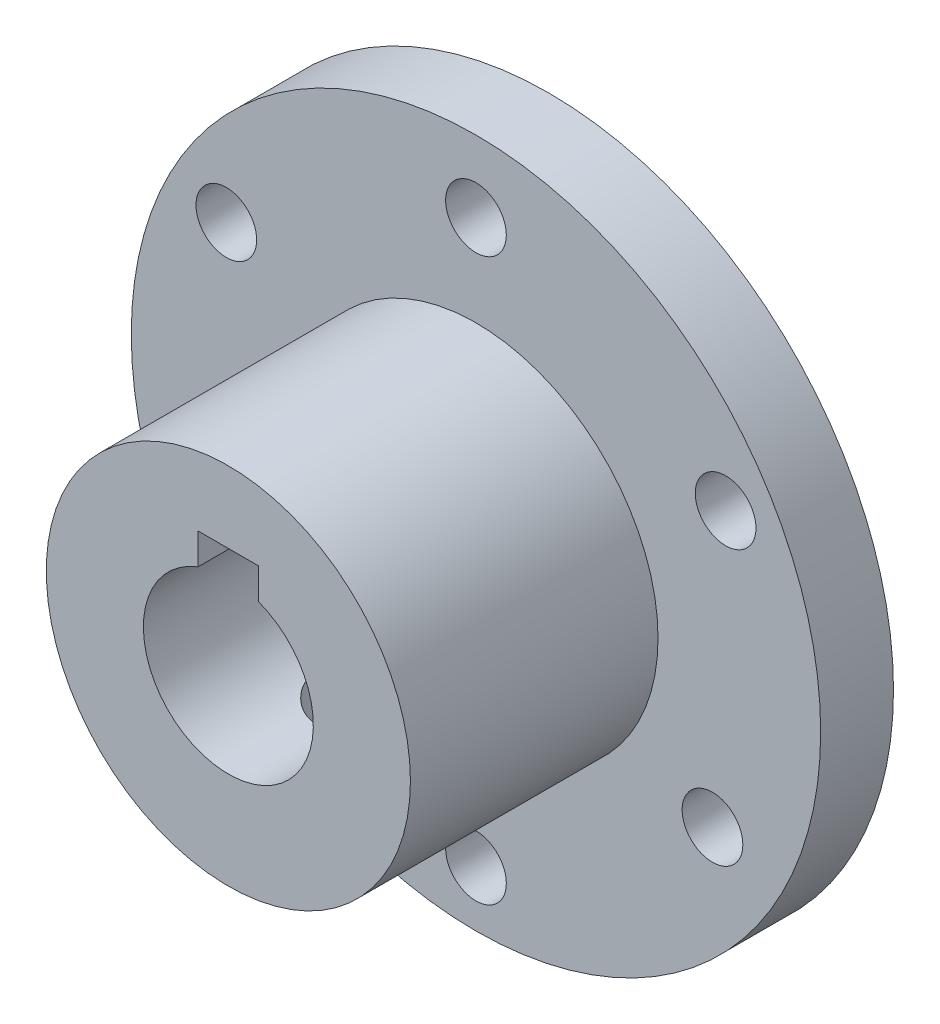
ISO-10303-21;
HEADER;
FILE_DESCRIPTION(('STEP AP214'),'2;1');
FILE_NAME('part.step','',(''),(''),'','','');
FILE_SCHEMA(('AUTOMOTIVE_DESIGN { 1 0 10303 214 1 1 1 1 }'));
ENDSEC;
DATA;
#1=APPLICATION_CONTEXT('core data for automotive mechanical design processes');
#2=APPLICATION_PROTOCOL_DEFINITION('international standard','automotive_design',2000,#1);
#3=PRODUCT_CONTEXT('',#1,'mechanical');
#4=PRODUCT('Part','Part','',(#3));
#5=PRODUCT_RELATED_PRODUCT_CATEGORY('part','',(#4));
#6=PRODUCT_DEFINITION_FORMATION('','',#4);
#7=PRODUCT_DEFINITION_CONTEXT('part definition',#1,'design');
#8=PRODUCT_DEFINITION('design','',#6,#7);
#9=PRODUCT_DEFINITION_SHAPE('','',#8);
#10=(LENGTH_UNIT() NAMED_UNIT(*) SI_UNIT(.MILLI.,.METRE.));
#11=(NAMED_UNIT(*) PLANE_ANGLE_UNIT() SI_UNIT($,.RADIAN.));
#12=(NAMED_UNIT(*) SI_UNIT($,.STERADIAN.) SOLID_ANGLE_UNIT());
#13=UNCERTAINTY_MEASURE_WITH_UNIT(LENGTH_MEASURE(1.E-05),#10,'distance_accuracy_value','');
#14=(GEOMETRIC_REPRESENTATION_CONTEXT(3) GLOBAL_UNCERTAINTY_ASSIGNED_CONTEXT((#13)) GLOBAL_UNIT_ASSIGNED_CONTEXT((#10,
#11,#12)) REPRESENTATION_CONTEXT('',''));
#15=CARTESIAN_POINT('',(0.,0.,0.));
#16=DIRECTION('',(0.,0.,1.));
#17=DIRECTION('',(1.,0.,0.));
#18=AXIS2_PLACEMENT_3D('',#15,#16,#17);
#19=CARTESIAN_POINT('',(0.,0.,20.4));
#20=DIRECTION('',(0.,0.,1.));
#21=DIRECTION('',(1.,0.,0.));
#22=AXIS2_PLACEMENT_3D('',#19,#20,#21);
#23=PLANE('',#22);
#24=DIRECTION('',(0.,-1.,0.));
#25=VECTOR('',#24,1.);
#26=CARTESIAN_POINT('',(-2.5,4.9,20.4));
#27=LINE('',#26,#25);
#28=CARTESIAN_POINT('',(-2.5,9.1,20.4));
#29=VERTEX_POINT('',#28);
#30=CARTESIAN_POINT('',(-2.5,6.53834841531101,20.4));
#31=VERTEX_POINT('',#30);
#32=EDGE_CURVE('E105',#29,#31,#27,.T.);
#33=ORIENTED_EDGE('',*,*,#32,.F.);
#34=DIRECTION('',(-1.,0.,0.));
#35=VECTOR('',#34,1.);
#36=CARTESIAN_POINT('',(2.5,9.1,20.4));
#37=LINE('',#36,#35);
#38=CARTESIAN_POINT('',(2.5,9.1,20.4));
#39=VERTEX_POINT('',#38);
#40=EDGE_CURVE('E89',#39,#29,#37,.T.);
#41=ORIENTED_EDGE('',*,*,#40,.F.);
#42=DIRECTION('',(0.,1.,0.));
#43=VECTOR('',#42,1.);
#44=CARTESIAN_POINT('',(2.5,4.9,20.4));
#45=LINE('',#44,#43);
#46=CARTESIAN_POINT('',(2.5,6.53834841531101,20.4));
#47=VERTEX_POINT('',#46);
#48=EDGE_CURVE('E97',#47,#39,#45,.T.);
#49=ORIENTED_EDGE('',*,*,#48,.F.);
#50=CARTESIAN_POINT('',(0.,0.,20.4));
#51=DIRECTION('',(0.,0.,1.));
#52=DIRECTION('',(1.,0.,0.));
#53=AXIS2_PLACEMENT_3D('',#50,#51,#52);
#54=CIRCLE('',#53,7.);
#55=EDGE_CURVE('E179',#31,#47,#54,.T.);
#56=ORIENTED_EDGE('',*,*,#55,.F.);
#57=EDGE_LOOP('',(#33,#41,#49,#56));
#58=FACE_BOUND('',#57,.T.);
#59=CARTESIAN_POINT('',(0.,0.,20.4));
#60=DIRECTION('',(0.,0.,1.));
#61=DIRECTION('',(1.,0.,0.));
#62=AXIS2_PLACEMENT_3D('',#59,#60,#61);
#63=CIRCLE('',#62,15.);
#64=CARTESIAN_POINT('',(15.,0.,20.4));
#65=VERTEX_POINT('',#64);
#66=EDGE_CURVE('E182',#65,#65,#63,.T.);
#67=ORIENTED_EDGE('',*,*,#66,.T.);
#68=EDGE_LOOP('',(#67));
#69=FACE_BOUND('',#68,.T.);
#70=ADVANCED_FACE('F39',(#58,#69),#23,.T.);
#71=CARTESIAN_POINT('',(0.,0.,20.4));
#72=DIRECTION('',(0.,0.,-1.));
#73=DIRECTION('',(-1.,0.,0.));
#74=AXIS2_PLACEMENT_3D('',#71,#72,#73);
#75=CYLINDRICAL_SURFACE('',#74,15.);
#76=CARTESIAN_POINT('',(0.,-15.,13.2));
#77=CARTESIAN_POINT('',(0.1667307203779,-14.9999969274261,13.199993866505));
#78=CARTESIAN_POINT('',(0.333538980604567,-14.9971915553469,13.1860534710971));
#79=CARTESIAN_POINT('',(0.662440523067058,-14.9862709686969,13.1307044996543));
#80=CARTESIAN_POINT('',(0.824529952624067,-14.9781515358056,13.0892741015955));
#81=CARTESIAN_POINT('',(1.13919091578994,-14.9575094783486,12.9802761791376));
#82=CARTESIAN_POINT('',(1.2917714037994,-14.9449910723015,12.9127336894659));
#83=CARTESIAN_POINT('',(1.58342396659268,-14.9169119410594,12.7535032574661));
#84=CARTESIAN_POINT('',(1.72249684522744,-14.9013513970712,12.6618167531784));
#85=CARTESIAN_POINT('',(1.9850804319446,-14.8686649598991,12.4555845171257));
#86=CARTESIAN_POINT('',(2.10838185347557,-14.8515223651304,12.3407749338264));
#87=CARTESIAN_POINT('',(2.33411026982409,-14.8177254135776,12.0921227508249));
#88=CARTESIAN_POINT('',(2.43653563431127,-14.8010710950127,11.9582786659946));
#89=CARTESIAN_POINT('',(2.61849526004286,-14.7699732543785,11.6738514209644));
#90=CARTESIAN_POINT('',(2.6978128165976,-14.7555512209484,11.5231270686109));
#91=CARTESIAN_POINT('',(2.82991699974092,-14.7307880417525,11.2101545429878));
#92=CARTESIAN_POINT('',(2.88270624731171,-14.7204464928588,11.047907509961));
#93=CARTESIAN_POINT('',(2.95957589965448,-14.7051841575661,10.7187469082762));
#94=CARTESIAN_POINT('',(2.98402349387633,-14.7001941032156,10.5519223675733));
#95=CARTESIAN_POINT('',(3.00465638317836,-14.6959912518188,10.216470535907));
#96=CARTESIAN_POINT('',(3.0008445681405,-14.6967778640352,10.0478434310396));
#97=CARTESIAN_POINT('',(2.96536371930546,-14.7039765344455,9.71625963593699));
#98=CARTESIAN_POINT('',(2.93411562073172,-14.7103035857629,9.55325578311806));
#99=CARTESIAN_POINT('',(2.84531365386915,-14.7277363848,9.23485177001099));
#100=CARTESIAN_POINT('',(2.78775852930204,-14.7388423607334,9.07945197324297));
#101=CARTESIAN_POINT('',(2.64757435102416,-14.7646685550122,8.7794542148892));
#102=CARTESIAN_POINT('',(2.56477845369634,-14.7794126944111,8.63493636129248));
#103=CARTESIAN_POINT('',(2.37658072371804,-14.8108385631919,8.36168745008156));
#104=CARTESIAN_POINT('',(2.27117629307049,-14.827520515151,8.23295820944653));
#105=CARTESIAN_POINT('',(2.03849980368175,-14.8613106372439,7.99251179262919));
#106=CARTESIAN_POINT('',(1.91086848363733,-14.8784210763271,7.88114229642261));
#107=CARTESIAN_POINT('',(1.63855507218603,-14.9108654614323,7.68133846109633));
#108=CARTESIAN_POINT('',(1.49387276213817,-14.9261993846692,7.59290441611926));
#109=CARTESIAN_POINT('',(1.19117816063676,-14.9534007048266,7.44141747232207));
#110=CARTESIAN_POINT('',(1.0331454587559,-14.9652626654482,7.37840431906639));
#111=CARTESIAN_POINT('',(0.708446929345995,-14.9841422696357,7.2799185778843));
#112=CARTESIAN_POINT('',(0.541782150217349,-14.9911605000159,7.24444265377911));
#113=CARTESIAN_POINT('',(0.207538216881452,-14.999480156006,7.20253063861717));
#114=CARTESIAN_POINT('',(0.0400209849767288,-15.0008752395741,7.19561874137919));
#115=CARTESIAN_POINT('',(-0.293774802578142,-14.9980515579031,7.20974957682654));
#116=CARTESIAN_POINT('',(-0.460053427331379,-14.9938331082434,7.23079073805779));
#117=CARTESIAN_POINT('',(-0.785116979839622,-14.9803149602405,7.29983512063187));
#118=CARTESIAN_POINT('',(-0.943955845019709,-14.9710612921262,7.34759420549371));
#119=CARTESIAN_POINT('',(-1.251370882499,-14.948506561831,7.46845194796743));
#120=CARTESIAN_POINT('',(-1.39994628491262,-14.9352051964268,7.54155250403049));
#121=CARTESIAN_POINT('',(-1.68462352105865,-14.9057973459988,7.71204747195394));
#122=CARTESIAN_POINT('',(-1.82055038025656,-14.8896585131116,7.80972834311684));
#123=CARTESIAN_POINT('',(-2.07425405735762,-14.8564420448965,8.02622757362184));
#124=CARTESIAN_POINT('',(-2.19202892679229,-14.8393643090516,8.1450481991996));
#125=CARTESIAN_POINT('',(-2.40792177232253,-14.8058791067089,8.40262005567337));
#126=CARTESIAN_POINT('',(-2.50571310734597,-14.7894858069991,8.54164723266401));
#127=CARTESIAN_POINT('',(-2.67655626015362,-14.7595257538858,8.83443408407004));
#128=CARTESIAN_POINT('',(-2.74960906776871,-14.7459588874003,8.98819316872066));
#129=CARTESIAN_POINT('',(-2.86845552474588,-14.7233022175315,9.30530473844864));
#130=CARTESIAN_POINT('',(-2.91439049937315,-14.7141892461656,9.46860252363096));
#131=CARTESIAN_POINT('',(-2.97812595488159,-14.7014231037608,9.80080036047271));
#132=CARTESIAN_POINT('',(-2.99593010467534,-14.6977692207333,9.96969967862804));
#133=CARTESIAN_POINT('',(-3.00276273260241,-14.6963744889414,10.305026593633));
#134=CARTESIAN_POINT('',(-2.99230736421269,-14.698527575679,10.471443446781));
#135=CARTESIAN_POINT('',(-2.94405691230018,-14.7082672045384,10.8000949497151));
#136=CARTESIAN_POINT('',(-2.90626204838789,-14.7158537030151,10.9623296330844));
#137=CARTESIAN_POINT('',(-2.80463570549686,-14.7355579265748,11.2776831337216));
#138=CARTESIAN_POINT('',(-2.74086752015203,-14.7476646305649,11.4308230815072));
#139=CARTESIAN_POINT('',(-2.58916393380481,-14.7750514492251,11.7243111622033));
#140=CARTESIAN_POINT('',(-2.50122650632465,-14.7903318299668,11.8646582211754));
#141=CARTESIAN_POINT('',(-2.30191774435924,-14.8226688156968,12.1311467164509));
#142=CARTESIAN_POINT('',(-2.19017366170554,-14.839751187291,12.2570062958028));
#143=CARTESIAN_POINT('',(-1.94719310703942,-14.8735824561586,12.4883586165875));
#144=CARTESIAN_POINT('',(-1.81595216146,-14.8903312758955,12.5938466709518));
#145=CARTESIAN_POINT('',(-1.53605288726474,-14.9218149716391,12.7825039318393));
#146=CARTESIAN_POINT('',(-1.3872266532895,-14.9365269365774,12.8654280098401));
#147=CARTESIAN_POINT('',(-1.0774990828222,-14.96205375255,13.0049583677898));
#148=CARTESIAN_POINT('',(-0.916608782589379,-14.9728721141585,13.0615883685975));
#149=CARTESIAN_POINT('',(-0.629464466771338,-14.9872911778611,13.1359558441341));
#150=CARTESIAN_POINT('',(-0.504844992041353,-14.9920290947535,13.1599295811233));
#151=CARTESIAN_POINT('',(-0.2534985756302,-14.9983846241968,13.1919537370751));
#152=CARTESIAN_POINT('',(-0.126771701245857,-15.0000023361946,13.2000046635293));
#153=CARTESIAN_POINT('',(0.,-15.,13.2));
#154=B_SPLINE_CURVE_WITH_KNOTS('',3,(#76,#77,#78,#79,#80,#81,#82,#83,#84,#85,#86,#87,#88,#89,
#90,#91,#92,#93,#94,#95,#96,#97,#98,#99,#100,#101,#102,#103,#104,#105,#106,#107,#108,#109,#110,
#111,#112,#113,#114,#115,#116,#117,#118,#119,#120,#121,#122,#123,#124,#125,#126,#127,#128,#129,
#130,#131,#132,#133,#134,#135,#136,#137,#138,#139,#140,#141,#142,#143,#144,#145,#146,#147,#148,
#149,#150,#151,#152,#153),.UNSPECIFIED.,.T.,.F.,(4,2,2,2,2,2,2,2,2,2,2,2,2,2,2,2,2,2,2,2,2,2,2,
2,2,2,2,2,2,2,2,2,2,2,2,2,2,2,4),(0.,0.499728391983775,0.99985395207397,1.49950120575103,
1.99911870669259,2.50479801033656,3.0105167902421,3.52083585017768,4.03110448095592,
4.53468555310762,5.03821512843675,5.53415181018835,6.03011217761189,6.52942470610778,
7.02879464249011,7.53714757474052,8.04550702619461,8.55465824562072,9.06374777094108,
9.56432207028796,10.064868229736,10.5609136185217,11.0569961764807,11.5591519810008,
12.0613616503779,12.5712188573768,13.081055661704,13.5882114309817,14.0953010499124,
14.593191677031,15.0910783047783,15.5877588375933,16.084481027456,16.5896422871743,
17.0949196359879,17.6054849002691,18.1155886655256,18.4955632586968,18.8755257411299),.UNSPECIFIED.);
#155=CARTESIAN_POINT('',(0.,-15.,13.2));
#156=VERTEX_POINT('',#155);
#157=EDGE_CURVE('E201',#156,#156,#154,.T.);
#158=ORIENTED_EDGE('',*,*,#157,.T.);
#159=EDGE_LOOP('',(#158));
#160=FACE_BOUND('',#159,.T.);
#161=ORIENTED_EDGE('',*,*,#66,.F.);
#162=EDGE_LOOP('',(#161));
#163=FACE_BOUND('',#162,.T.);
#164=CARTESIAN_POINT('',(0.,0.,0.));
#165=DIRECTION('',(0.,0.,1.));
#166=DIRECTION('',(1.,0.,0.));
#167=AXIS2_PLACEMENT_3D('',#164,#165,#166);
#168=CIRCLE('',#167,15.);
#169=CARTESIAN_POINT('',(15.,0.,0.));
#170=VERTEX_POINT('',#169);
#171=EDGE_CURVE('E175',#170,#170,#168,.T.);
#172=ORIENTED_EDGE('',*,*,#171,.T.);
#173=EDGE_LOOP('',(#172));
#174=FACE_BOUND('',#173,.T.);
#175=ADVANCED_FACE('F41',(#160,#163,#174),#75,.T.);
#176=CARTESIAN_POINT('',(0.,0.,20.4));
#177=DIRECTION('',(0.,0.,-1.));
#178=DIRECTION('',(-1.,0.,0.));
#179=AXIS2_PLACEMENT_3D('',#176,#177,#178);
#180=CYLINDRICAL_SURFACE('',#179,7.);
#181=CARTESIAN_POINT('',(0.,-7.,13.2));
#182=CARTESIAN_POINT('',(0.160281740269091,-6.9999940839629,13.1999925304185));
#183=CARTESIAN_POINT('',(0.320833907522429,-6.99443250051265,13.1870786839035));
#184=CARTESIAN_POINT('',(0.637349314958984,-6.97273920628719,13.1359176345735));
#185=CARTESIAN_POINT('',(0.793299928144206,-6.95658080950724,13.0976064709267));
#186=CARTESIAN_POINT('',(1.0955347051483,-6.91541630739346,12.9973302363749));
#187=CARTESIAN_POINT('',(1.24185033642246,-6.89044089228941,12.9354471561946));
#188=CARTESIAN_POINT('',(1.5218733278968,-6.83405660276648,12.7901355814363));
#189=CARTESIAN_POINT('',(1.6555840905338,-6.80264947176647,12.7067129239082));
#190=CARTESIAN_POINT('',(1.91384144205639,-6.7346782187555,12.5160723523121));
#191=CARTESIAN_POINT('',(2.03764045493602,-6.69793895962371,12.4079047401042));
#192=CARTESIAN_POINT('',(2.26599040232609,-6.62417654338771,12.1728561314992));
#193=CARTESIAN_POINT('',(2.3705306503261,-6.5871532404671,12.0459648153973));
#194=CARTESIAN_POINT('',(2.56285686126492,-6.51482055271223,11.7689672772845));
#195=CARTESIAN_POINT('',(2.64946811752636,-6.47970460244924,11.6179895419707));
#196=CARTESIAN_POINT('',(2.79573199408101,-6.41796168635026,11.301890571811));
#197=CARTESIAN_POINT('',(2.8553992914263,-6.39133010120133,11.1367770955138));
#198=CARTESIAN_POINT('',(2.94294919918374,-6.35147799087276,10.8056992616908));
#199=CARTESIAN_POINT('',(2.97227494401776,-6.3376522143554,10.6401922982205));
#200=CARTESIAN_POINT('',(3.00280607158394,-6.32324849688131,10.3060740303897));
#201=CARTESIAN_POINT('',(3.00402828615096,-6.32266262625149,10.1374646447086));
#202=CARTESIAN_POINT('',(2.97939999510613,-6.33429573902539,9.81670009628145));
#203=CARTESIAN_POINT('',(2.95576113815072,-6.34546870930158,9.664329376668));
#204=CARTESIAN_POINT('',(2.88580772808799,-6.37758411517576,9.36597241409867));
#205=CARTESIAN_POINT('',(2.83948852833539,-6.39852855266591,9.21998748611386));
#206=CARTESIAN_POINT('',(2.7245765907069,-6.44830685655465,8.93475284856477));
#207=CARTESIAN_POINT('',(2.65551974428426,-6.47730295111391,8.79571970578185));
#208=CARTESIAN_POINT('',(2.49742304873013,-6.53988493882129,8.53065367593057));
#209=CARTESIAN_POINT('',(2.40837507480489,-6.57347269593628,8.4046261050705));
#210=CARTESIAN_POINT('',(2.20343405392229,-6.64512404535213,8.15722249637862));
#211=CARTESIAN_POINT('',(2.08584728856133,-6.68331855389208,8.03728327052803));
#212=CARTESIAN_POINT('',(1.83187332405076,-6.75734605758523,7.81832840934405));
#213=CARTESIAN_POINT('',(1.6954812162799,-6.79317843254652,7.71931825412179));
#214=CARTESIAN_POINT('',(1.40318582301271,-6.8595969368957,7.54275606719303));
#215=CARTESIAN_POINT('',(1.24687114970231,-6.89002455033727,7.46582098129442));
#216=CARTESIAN_POINT('',(0.921879694158935,-6.94097396260558,7.33984976238528));
#217=CARTESIAN_POINT('',(0.753210215657665,-6.96150156039981,7.2907972940223));
#218=CARTESIAN_POINT('',(0.42027623894137,-6.98923526893385,7.22506613954103));
#219=CARTESIAN_POINT('',(0.256457961010924,-6.99723249964589,7.20646123468561));
#220=CARTESIAN_POINT('',(-0.0721433011185075,-7.00155416651738,7.19637042359177));
#221=CARTESIAN_POINT('',(-0.236925971900556,-6.99788220531666,7.20487614746763));
#222=CARTESIAN_POINT('',(-0.553542439626671,-6.9797867632015,7.24741563205481));
#223=CARTESIAN_POINT('',(-0.705598931504217,-6.96594519473644,7.28006832144833));
#224=CARTESIAN_POINT('',(-1.00189113639242,-6.92953888009974,7.36802089423816));
#225=CARTESIAN_POINT('',(-1.14612587370002,-6.90697304848521,7.42332359572216));
#226=CARTESIAN_POINT('',(-1.42777696523888,-6.8543875151372,7.55680115950212));
#227=CARTESIAN_POINT('',(-1.56483974951836,-6.82415705388474,7.63563633022606));
#228=CARTESIAN_POINT('',(-1.82428490564705,-6.75942988391438,7.81321894447593));
#229=CARTESIAN_POINT('',(-1.94666097512992,-6.72493135648758,7.91197488802329));
#230=CARTESIAN_POINT('',(-2.18296759532595,-6.65214788697903,8.13528958784289));
#231=CARTESIAN_POINT('',(-2.29556617553686,-6.61377354998591,8.26123221006139));
#232=CARTESIAN_POINT('',(-2.49843431443676,-6.53984037690253,8.53078229863161));
#233=CARTESIAN_POINT('',(-2.58869766421195,-6.50428232556792,8.67439466037483));
#234=CARTESIAN_POINT('',(-2.74563875632303,-6.4396296928532,8.97881385295857));
#235=CARTESIAN_POINT('',(-2.81186415020233,-6.41066255987443,9.13988300904999));
#236=CARTESIAN_POINT('',(-2.91565885028324,-6.36413607530145,9.4725263267395));
#237=CARTESIAN_POINT('',(-2.95325364225748,-6.346566580073,9.64409099832457));
#238=CARTESIAN_POINT('',(-2.9961194841997,-6.32643481136621,9.97799117233295));
#239=CARTESIAN_POINT('',(-3.00374693238451,-6.3227792566546,10.1399592675106));
#240=CARTESIAN_POINT('',(-2.99282649265778,-6.32795618271386,10.4627897469115));
#241=CARTESIAN_POINT('',(-2.97428322126543,-6.33678646098226,10.6236523211193));
#242=CARTESIAN_POINT('',(-2.91356431394149,-6.3649165389077,10.9310416962734));
#243=CARTESIAN_POINT('',(-2.87266975661122,-6.38364713099396,11.0778787915707));
#244=CARTESIAN_POINT('',(-2.769702223632,-6.42898875831973,11.3626207660839));
#245=CARTESIAN_POINT('',(-2.70762322652258,-6.45560203384715,11.5005230924077));
#246=CARTESIAN_POINT('',(-2.55963250501149,-6.5157524732596,11.7728207086796));
#247=CARTESIAN_POINT('',(-2.47248232196069,-6.5496164957701,11.9064691536948));
#248=CARTESIAN_POINT('',(-2.2784960092513,-6.61959778926566,12.1579823612475));
#249=CARTESIAN_POINT('',(-2.17165243666714,-6.6557159087398,12.2758411270492));
#250=CARTESIAN_POINT('',(-1.93135048700133,-6.72955424641834,12.5020036355007));
#251=CARTESIAN_POINT('',(-1.79645724733279,-6.76717599448736,12.6088195655728));
#252=CARTESIAN_POINT('',(-1.50919760355001,-6.83696477009089,12.7984397600312));
#253=CARTESIAN_POINT('',(-1.35682332068822,-6.86912932173673,12.8812331375999));
#254=CARTESIAN_POINT('',(-1.11954532843042,-6.91035442086788,12.9845926909895));
#255=CARTESIAN_POINT('',(-1.03957288024831,-6.92286397965452,13.0154332908018));
#256=CARTESIAN_POINT('',(-0.876970802782698,-6.94533202163241,13.0702382020223));
#257=CARTESIAN_POINT('',(-0.794342461515169,-6.95529172101821,13.0942057922754));
#258=CARTESIAN_POINT('',(-0.627265567421399,-6.97234378079151,13.1349477172834));
#259=CARTESIAN_POINT('',(-0.542821986677289,-6.97944312738119,13.1517395843805));
#260=CARTESIAN_POINT('',(-0.372647906839317,-6.99059319635283,13.1780087142034));
#261=CARTESIAN_POINT('',(-0.286918376030206,-6.99464610559385,13.1874912240139));
#262=CARTESIAN_POINT('',(-0.167492669563776,-6.99807592564235,13.1955082749436));
#263=CARTESIAN_POINT('',(-0.134021137958667,-6.99879677015532,13.1971918541176));
#264=CARTESIAN_POINT('',(-0.0670370145842116,-6.99975942751561,13.1994385012841));
#265=CARTESIAN_POINT('',(-0.0335244225617061,-7.0000012373944,13.2000015623327));
#266=CARTESIAN_POINT('',(0.,-7.,13.2));
#267=B_SPLINE_CURVE_WITH_KNOTS('',3,(#181,#182,#183,#184,#185,#186,#187,#188,#189,#190,#191,
#192,#193,#194,#195,#196,#197,#198,#199,#200,#201,#202,#203,#204,#205,#206,#207,#208,#209,#210,
#211,#212,#213,#214,#215,#216,#217,#218,#219,#220,#221,#222,#223,#224,#225,#226,#227,#228,#229,
#230,#231,#232,#233,#234,#235,#236,#237,#238,#239,#240,#241,#242,#243,#244,#245,#246,#247,#248,
#249,#250,#251,#252,#253,#254,#255,#256,#257,#258,#259,#260,#261,#262,#263,#264,#265,#266),
.UNSPECIFIED.,.T.,.F.,(4,2,2,2,2,2,2,2,2,2,2,2,2,2,2,2,2,2,2,2,2,2,2,2,2,2,2,2,2,2,2,2,2,2,2,2,
2,2,2,2,2,2,4),(0.,0.480714322748849,0.962643903423346,1.44291226275142,1.92305060961531,
2.42622743558506,2.92968263421744,3.45969560860062,3.98941952228263,4.492594268281,
4.99546764377915,5.45710720323576,5.91884138089948,6.3906540887232,6.86265889892285,
7.37709837725841,7.89167239108963,8.41947244601234,8.94696296364742,9.43957347502028,
9.93203191709568,10.3983119423363,10.8646499992176,11.3455505516221,11.8266567358409,
12.3440285038672,12.8615439335848,13.3883469079738,13.9146803943341,14.3986848887267,
14.882604015318,15.341320451094,15.8001673810816,16.2874475008663,16.7749121624767,
17.3008416934143,17.8270092002163,18.0865840789243,18.3460349177801,18.6048481685098,
18.8634754544625,18.964020720529,19.0645666096629),.UNSPECIFIED.);
#268=CARTESIAN_POINT('',(0.,-7.,13.2));
#269=VERTEX_POINT('',#268);
#270=EDGE_CURVE('E44',#269,#269,#267,.T.);
#271=ORIENTED_EDGE('',*,*,#270,.F.);
#272=EDGE_LOOP('',(#271));
#273=FACE_BOUND('',#272,.T.);
#274=DIRECTION('',(0.,0.,-1.));
#275=VECTOR('',#274,1.);
#276=CARTESIAN_POINT('',(-2.5,6.53834841531101,20.4));
#277=LINE('',#276,#275);
#278=CARTESIAN_POINT('',(-2.5,6.53834841531101,-6.));
#279=VERTEX_POINT('',#278);
#280=EDGE_CURVE('E69',#31,#279,#277,.T.);
#281=ORIENTED_EDGE('',*,*,#280,.F.);
#282=ORIENTED_EDGE('',*,*,#55,.T.);
#283=DIRECTION('',(0.,0.,-1.));
#284=VECTOR('',#283,1.);
#285=CARTESIAN_POINT('',(2.5,6.53834841531101,20.4));
#286=LINE('',#285,#284);
#287=CARTESIAN_POINT('',(2.5,6.53834841531101,-6.));
#288=VERTEX_POINT('',#287);
#289=EDGE_CURVE('E100',#288,#47,#286,.F.);
#290=ORIENTED_EDGE('',*,*,#289,.F.);
#291=CARTESIAN_POINT('',(0.,0.,-6.));
#292=DIRECTION('',(0.,0.,-1.));
#293=DIRECTION('',(-1.,0.,0.));
#294=AXIS2_PLACEMENT_3D('',#291,#292,#293);
#295=CIRCLE('',#294,7.);
#296=EDGE_CURVE('E123',#288,#279,#295,.T.);
#297=ORIENTED_EDGE('',*,*,#296,.T.);
#298=EDGE_LOOP('',(#281,#282,#290,#297));
#299=FACE_BOUND('',#298,.T.);
#300=ADVANCED_FACE('F196',(#273,#299),#180,.F.);
#301=CARTESIAN_POINT('',(0.,0.,-6.));
#302=DIRECTION('',(0.,0.,-1.));
#303=DIRECTION('',(-1.,0.,0.));
#304=AXIS2_PLACEMENT_3D('',#301,#302,#303);
#305=PLANE('',#304);
#306=DIRECTION('',(0.,1.,0.));
#307=VECTOR('',#306,1.);
#308=CARTESIAN_POINT('',(-2.5,0.,-6.));
#309=LINE('',#308,#307);
#310=CARTESIAN_POINT('',(-2.5,9.1,-6.));
#311=VERTEX_POINT('',#310);
#312=EDGE_CURVE('E11',#279,#311,#309,.T.);
#313=ORIENTED_EDGE('',*,*,#312,.F.);
#314=ORIENTED_EDGE('',*,*,#296,.F.);
#315=DIRECTION('',(0.,-1.,0.));
#316=VECTOR('',#315,1.);
#317=CARTESIAN_POINT('',(2.5,0.,-6.));
#318=LINE('',#317,#316);
#319=CARTESIAN_POINT('',(2.5,9.1,-6.));
#320=VERTEX_POINT('',#319);
#321=EDGE_CURVE('E186',#320,#288,#318,.T.);
#322=ORIENTED_EDGE('',*,*,#321,.F.);
#323=DIRECTION('',(1.,0.,0.));
#324=VECTOR('',#323,1.);
#325=CARTESIAN_POINT('',(0.,9.1,-6.));
#326=LINE('',#325,#324);
#327=EDGE_CURVE('E55',#311,#320,#326,.T.);
#328=ORIENTED_EDGE('',*,*,#327,.F.);
#329=EDGE_LOOP('',(#313,#314,#322,#328));
#330=FACE_BOUND('',#329,.T.);
#331=CARTESIAN_POINT('',(0.,-23.75,-6.));
#332=DIRECTION('',(0.,0.,1.));
#333=DIRECTION('',(1.,0.,0.));
#334=AXIS2_PLACEMENT_3D('',#331,#332,#333);
#335=CIRCLE('',#334,2.5);
#336=CARTESIAN_POINT('',(2.5,-23.75,-6.));
#337=VERTEX_POINT('',#336);
#338=EDGE_CURVE('E119',#337,#337,#335,.T.);
#339=ORIENTED_EDGE('',*,*,#338,.T.);
#340=EDGE_LOOP('',(#339));
#341=FACE_BOUND('',#340,.T.);
#342=CARTESIAN_POINT('',(-20.5681033398804,11.8750000000001,-6.));
#343=DIRECTION('',(0.,0.,1.));
#344=DIRECTION('',(1.,0.,0.));
#345=AXIS2_PLACEMENT_3D('',#342,#343,#344);
#346=CIRCLE('',#345,2.5);
#347=CARTESIAN_POINT('',(-18.0681033398804,11.8750000000001,-6.));
#348=VERTEX_POINT('',#347);
#349=EDGE_CURVE('E128',#348,#348,#346,.T.);
#350=ORIENTED_EDGE('',*,*,#349,.T.);
#351=EDGE_LOOP('',(#350));
#352=FACE_BOUND('',#351,.T.);
#353=CARTESIAN_POINT('',(20.5681033398805,11.8749999999998,-6.));
#354=DIRECTION('',(0.,0.,1.));
#355=DIRECTION('',(1.,0.,0.));
#356=AXIS2_PLACEMENT_3D('',#353,#354,#355);
#357=CIRCLE('',#356,2.5);
#358=CARTESIAN_POINT('',(23.0681033398805,11.8749999999998,-6.));
#359=VERTEX_POINT('',#358);
#360=EDGE_CURVE('E136',#359,#359,#357,.T.);
#361=ORIENTED_EDGE('',*,*,#360,.T.);
#362=EDGE_LOOP('',(#361));
#363=FACE_BOUND('',#362,.T.);
#364=CARTESIAN_POINT('',(19.4855715851499,-11.25,-6.));
#365=DIRECTION('',(0.,0.,1.));
#366=DIRECTION('',(1.,0.,0.));
#367=AXIS2_PLACEMENT_3D('',#364,#365,#366);
#368=CIRCLE('',#367,2.5);
#369=CARTESIAN_POINT('',(21.9855715851499,-11.25,-6.));
#370=VERTEX_POINT('',#369);
#371=EDGE_CURVE('E144',#370,#370,#368,.T.);
#372=ORIENTED_EDGE('',*,*,#371,.T.);
#373=EDGE_LOOP('',(#372));
#374=FACE_BOUND('',#373,.T.);
#375=CARTESIAN_POINT('',(-19.4855715851499,-11.2499999999999,-6.));
#376=DIRECTION('',(0.,0.,1.));
#377=DIRECTION('',(1.,0.,0.));
#378=AXIS2_PLACEMENT_3D('',#375,#376,#377);
#379=CIRCLE('',#378,2.5);
#380=CARTESIAN_POINT('',(-16.9855715851499,-11.2499999999999,-6.));
#381=VERTEX_POINT('',#380);
#382=EDGE_CURVE('E152',#381,#381,#379,.T.);
#383=ORIENTED_EDGE('',*,*,#382,.T.);
#384=EDGE_LOOP('',(#383));
#385=FACE_BOUND('',#384,.T.);
#386=CARTESIAN_POINT('',(2.34187669256869E-13,22.5,-6.));
#387=DIRECTION('',(0.,0.,1.));
#388=DIRECTION('',(1.,0.,0.));
#389=AXIS2_PLACEMENT_3D('',#386,#387,#388);
#390=CIRCLE('',#389,2.5);
#391=CARTESIAN_POINT('',(2.50000000000023,22.5,-6.));
#392=VERTEX_POINT('',#391);
#393=EDGE_CURVE('E160',#392,#392,#390,.T.);
#394=ORIENTED_EDGE('',*,*,#393,.T.);
#395=EDGE_LOOP('',(#394));
#396=FACE_BOUND('',#395,.T.);
#397=CARTESIAN_POINT('',(0.,0.,-6.));
#398=DIRECTION('',(0.,0.,-1.));
#399=DIRECTION('',(-1.,0.,0.));
#400=AXIS2_PLACEMENT_3D('',#397,#398,#399);
#401=CIRCLE('',#400,28.4);
#402=CARTESIAN_POINT('',(-28.4,0.,-6.));
#403=VERTEX_POINT('',#402);
#404=EDGE_CURVE('E171',#403,#403,#401,.T.);
#405=ORIENTED_EDGE('',*,*,#404,.T.);
#406=EDGE_LOOP('',(#405));
#407=FACE_BOUND('',#406,.T.);
#408=ADVANCED_FACE('F197',(#330,#341,#352,#363,#374,#385,#396,#407),#305,.T.);
#409=CARTESIAN_POINT('',(0.,0.,0.));
#410=DIRECTION('',(0.,0.,-1.));
#411=DIRECTION('',(-1.,0.,0.));
#412=AXIS2_PLACEMENT_3D('',#409,#410,#411);
#413=PLANE('',#412);
#414=CARTESIAN_POINT('',(0.,-23.75,0.));
#415=DIRECTION('',(0.,0.,1.));
#416=DIRECTION('',(1.,0.,0.));
#417=AXIS2_PLACEMENT_3D('',#414,#415,#416);
#418=CIRCLE('',#417,2.5);
#419=CARTESIAN_POINT('',(2.5,-23.75,0.));
#420=VERTEX_POINT('',#419);
#421=EDGE_CURVE('E124',#420,#420,#418,.T.);
#422=ORIENTED_EDGE('',*,*,#421,.F.);
#423=EDGE_LOOP('',(#422));
#424=FACE_BOUND('',#423,.T.);
#425=CARTESIAN_POINT('',(-20.5681033398804,11.8750000000001,0.));
#426=DIRECTION('',(0.,0.,1.));
#427=DIRECTION('',(1.,0.,0.));
#428=AXIS2_PLACEMENT_3D('',#425,#426,#427);
#429=CIRCLE('',#428,2.5);
#430=CARTESIAN_POINT('',(-18.0681033398804,11.8750000000001,0.));
#431=VERTEX_POINT('',#430);
#432=EDGE_CURVE('E132',#431,#431,#429,.T.);
#433=ORIENTED_EDGE('',*,*,#432,.F.);
#434=EDGE_LOOP('',(#433));
#435=FACE_BOUND('',#434,.T.);
#436=CARTESIAN_POINT('',(20.5681033398805,11.8749999999998,0.));
#437=DIRECTION('',(0.,0.,1.));
#438=DIRECTION('',(1.,0.,0.));
#439=AXIS2_PLACEMENT_3D('',#436,#437,#438);
#440=CIRCLE('',#439,2.5);
#441=CARTESIAN_POINT('',(23.0681033398805,11.8749999999998,0.));
#442=VERTEX_POINT('',#441);
#443=EDGE_CURVE('E140',#442,#442,#440,.T.);
#444=ORIENTED_EDGE('',*,*,#443,.F.);
#445=EDGE_LOOP('',(#444));
#446=FACE_BOUND('',#445,.T.);
#447=CARTESIAN_POINT('',(19.4855715851499,-11.25,0.));
#448=DIRECTION('',(0.,0.,1.));
#449=DIRECTION('',(1.,0.,0.));
#450=AXIS2_PLACEMENT_3D('',#447,#448,#449);
#451=CIRCLE('',#450,2.5);
#452=CARTESIAN_POINT('',(21.9855715851499,-11.25,0.));
#453=VERTEX_POINT('',#452);
#454=EDGE_CURVE('E148',#453,#453,#451,.T.);
#455=ORIENTED_EDGE('',*,*,#454,.F.);
#456=EDGE_LOOP('',(#455));
#457=FACE_BOUND('',#456,.T.);
#458=CARTESIAN_POINT('',(-19.4855715851499,-11.2499999999999,0.));
#459=DIRECTION('',(0.,0.,1.));
#460=DIRECTION('',(1.,0.,0.));
#461=AXIS2_PLACEMENT_3D('',#458,#459,#460);
#462=CIRCLE('',#461,2.5);
#463=CARTESIAN_POINT('',(-16.9855715851499,-11.2499999999999,0.));
#464=VERTEX_POINT('',#463);
#465=EDGE_CURVE('E156',#464,#464,#462,.T.);
#466=ORIENTED_EDGE('',*,*,#465,.F.);
#467=EDGE_LOOP('',(#466));
#468=FACE_BOUND('',#467,.T.);
#469=CARTESIAN_POINT('',(2.34187669256869E-13,22.5,0.));
#470=DIRECTION('',(0.,0.,1.));
#471=DIRECTION('',(1.,0.,0.));
#472=AXIS2_PLACEMENT_3D('',#469,#470,#471);
#473=CIRCLE('',#472,2.5);
#474=CARTESIAN_POINT('',(2.50000000000023,22.5,0.));
#475=VERTEX_POINT('',#474);
#476=EDGE_CURVE('E118',#475,#475,#473,.T.);
#477=ORIENTED_EDGE('',*,*,#476,.F.);
#478=EDGE_LOOP('',(#477));
#479=FACE_BOUND('',#478,.T.);
#480=ORIENTED_EDGE('',*,*,#171,.F.);
#481=EDGE_LOOP('',(#480));
#482=FACE_BOUND('',#481,.T.);
#483=CARTESIAN_POINT('',(0.,0.,0.));
#484=DIRECTION('',(0.,0.,-1.));
#485=DIRECTION('',(-1.,0.,0.));
#486=AXIS2_PLACEMENT_3D('',#483,#484,#485);
#487=CIRCLE('',#486,28.4);
#488=CARTESIAN_POINT('',(-28.4,0.,0.));
#489=VERTEX_POINT('',#488);
#490=EDGE_CURVE('E170',#489,#489,#487,.T.);
#491=ORIENTED_EDGE('',*,*,#490,.F.);
#492=EDGE_LOOP('',(#491));
#493=FACE_BOUND('',#492,.T.);
#494=ADVANCED_FACE('F247',(#424,#435,#446,#457,#468,#479,#482,#493),#413,.F.);
#495=CARTESIAN_POINT('',(0.,0.,-6.));
#496=DIRECTION('',(0.,0.,1.));
#497=DIRECTION('',(1.,0.,0.));
#498=AXIS2_PLACEMENT_3D('',#495,#496,#497);
#499=CYLINDRICAL_SURFACE('',#498,28.4);
#500=ORIENTED_EDGE('',*,*,#404,.F.);
#501=EDGE_LOOP('',(#500));
#502=FACE_BOUND('',#501,.T.);
#503=ORIENTED_EDGE('',*,*,#490,.T.);
#504=EDGE_LOOP('',(#503));
#505=FACE_BOUND('',#504,.T.);
#506=ADVANCED_FACE('F243',(#502,#505),#499,.T.);
#507=CARTESIAN_POINT('',(2.34187669256869E-13,22.5,-6.));
#508=DIRECTION('',(0.,0.,1.));
#509=DIRECTION('',(1.,0.,0.));
#510=AXIS2_PLACEMENT_3D('',#507,#508,#509);
#511=CYLINDRICAL_SURFACE('',#510,2.5);
#512=ORIENTED_EDGE('',*,*,#393,.F.);
#513=EDGE_LOOP('',(#512));
#514=FACE_BOUND('',#513,.T.);
#515=ORIENTED_EDGE('',*,*,#476,.T.);
#516=EDGE_LOOP('',(#515));
#517=FACE_BOUND('',#516,.T.);
#518=ADVANCED_FACE('F239',(#514,#517),#511,.F.);
#519=CARTESIAN_POINT('',(-19.4855715851499,-11.2499999999999,-6.));
#520=DIRECTION('',(0.,0.,1.));
#521=DIRECTION('',(1.,0.,0.));
#522=AXIS2_PLACEMENT_3D('',#519,#520,#521);
#523=CYLINDRICAL_SURFACE('',#522,2.5);
#524=ORIENTED_EDGE('',*,*,#382,.F.);
#525=EDGE_LOOP('',(#524));
#526=FACE_BOUND('',#525,.T.);
#527=ORIENTED_EDGE('',*,*,#465,.T.);
#528=EDGE_LOOP('',(#527));
#529=FACE_BOUND('',#528,.T.);
#530=ADVANCED_FACE('F235',(#526,#529),#523,.F.);
#531=CARTESIAN_POINT('',(19.4855715851499,-11.25,-6.));
#532=DIRECTION('',(0.,0.,1.));
#533=DIRECTION('',(1.,0.,0.));
#534=AXIS2_PLACEMENT_3D('',#531,#532,#533);
#535=CYLINDRICAL_SURFACE('',#534,2.5);
#536=ORIENTED_EDGE('',*,*,#371,.F.);
#537=EDGE_LOOP('',(#536));
#538=FACE_BOUND('',#537,.T.);
#539=ORIENTED_EDGE('',*,*,#454,.T.);
#540=EDGE_LOOP('',(#539));
#541=FACE_BOUND('',#540,.T.);
#542=ADVANCED_FACE('F231',(#538,#541),#535,.F.);
#543=CARTESIAN_POINT('',(20.5681033398805,11.8749999999998,-6.));
#544=DIRECTION('',(0.,0.,1.));
#545=DIRECTION('',(1.,0.,0.));
#546=AXIS2_PLACEMENT_3D('',#543,#544,#545);
#547=CYLINDRICAL_SURFACE('',#546,2.5);
#548=ORIENTED_EDGE('',*,*,#360,.F.);
#549=EDGE_LOOP('',(#548));
#550=FACE_BOUND('',#549,.T.);
#551=ORIENTED_EDGE('',*,*,#443,.T.);
#552=EDGE_LOOP('',(#551));
#553=FACE_BOUND('',#552,.T.);
#554=ADVANCED_FACE('F227',(#550,#553),#547,.F.);
#555=CARTESIAN_POINT('',(-20.5681033398804,11.8750000000001,-6.));
#556=DIRECTION('',(0.,0.,1.));
#557=DIRECTION('',(1.,0.,0.));
#558=AXIS2_PLACEMENT_3D('',#555,#556,#557);
#559=CYLINDRICAL_SURFACE('',#558,2.5);
#560=ORIENTED_EDGE('',*,*,#349,.F.);
#561=EDGE_LOOP('',(#560));
#562=FACE_BOUND('',#561,.T.);
#563=ORIENTED_EDGE('',*,*,#432,.T.);
#564=EDGE_LOOP('',(#563));
#565=FACE_BOUND('',#564,.T.);
#566=ADVANCED_FACE('F223',(#562,#565),#559,.F.);
#567=CARTESIAN_POINT('',(0.,-23.75,-6.));
#568=DIRECTION('',(0.,0.,1.));
#569=DIRECTION('',(1.,0.,0.));
#570=AXIS2_PLACEMENT_3D('',#567,#568,#569);
#571=CYLINDRICAL_SURFACE('',#570,2.5);
#572=ORIENTED_EDGE('',*,*,#338,.F.);
#573=EDGE_LOOP('',(#572));
#574=FACE_BOUND('',#573,.T.);
#575=ORIENTED_EDGE('',*,*,#421,.T.);
#576=EDGE_LOOP('',(#575));
#577=FACE_BOUND('',#576,.T.);
#578=ADVANCED_FACE('F220',(#574,#577),#571,.F.);
#579=CARTESIAN_POINT('',(-2.5,4.9,-29.6));
#580=DIRECTION('',(-1.,0.,0.));
#581=DIRECTION('',(0.,0.,1.));
#582=AXIS2_PLACEMENT_3D('',#579,#580,#581);
#583=PLANE('',#582);
#584=ORIENTED_EDGE('',*,*,#280,.T.);
#585=ORIENTED_EDGE('',*,*,#312,.T.);
#586=DIRECTION('',(0.,0.,1.));
#587=VECTOR('',#586,1.);
#588=CARTESIAN_POINT('',(-2.5,9.1,-29.6));
#589=LINE('',#588,#587);
#590=EDGE_CURVE('E94',#311,#29,#589,.T.);
#591=ORIENTED_EDGE('',*,*,#590,.T.);
#592=ORIENTED_EDGE('',*,*,#32,.T.);
#593=EDGE_LOOP('',(#584,#585,#591,#592));
#594=FACE_BOUND('',#593,.T.);
#595=ADVANCED_FACE('F199',(#594),#583,.F.);
#596=CARTESIAN_POINT('',(2.5,9.1,-29.6));
#597=DIRECTION('',(0.,1.,0.));
#598=DIRECTION('',(0.,0.,1.));
#599=AXIS2_PLACEMENT_3D('',#596,#597,#598);
#600=PLANE('',#599);
#601=ORIENTED_EDGE('',*,*,#327,.T.);
#602=DIRECTION('',(0.,0.,1.));
#603=VECTOR('',#602,1.);
#604=CARTESIAN_POINT('',(2.5,9.1,-29.6));
#605=LINE('',#604,#603);
#606=EDGE_CURVE('E62',#320,#39,#605,.T.);
#607=ORIENTED_EDGE('',*,*,#606,.T.);
#608=ORIENTED_EDGE('',*,*,#40,.T.);
#609=ORIENTED_EDGE('',*,*,#590,.F.);
#610=EDGE_LOOP('',(#601,#607,#608,#609));
#611=FACE_BOUND('',#610,.T.);
#612=ADVANCED_FACE('F86',(#611),#600,.F.);
#613=CARTESIAN_POINT('',(2.5,4.9,-29.6));
#614=DIRECTION('',(1.,0.,0.));
#615=DIRECTION('',(0.,0.,-1.));
#616=AXIS2_PLACEMENT_3D('',#613,#614,#615);
#617=PLANE('',#616);
#618=ORIENTED_EDGE('',*,*,#289,.T.);
#619=ORIENTED_EDGE('',*,*,#48,.T.);
#620=ORIENTED_EDGE('',*,*,#606,.F.);
#621=ORIENTED_EDGE('',*,*,#321,.T.);
#622=EDGE_LOOP('',(#618,#619,#620,#621));
#623=FACE_BOUND('',#622,.T.);
#624=ADVANCED_FACE('F98',(#623),#617,.F.);
#625=CARTESIAN_POINT('',(0.,-20.4,10.2));
#626=DIRECTION('',(0.,1.,0.));
#627=DIRECTION('',(0.,0.,1.));
#628=AXIS2_PLACEMENT_3D('',#625,#626,#627);
#629=CYLINDRICAL_SURFACE('',#628,3.);
#630=ORIENTED_EDGE('',*,*,#270,.T.);
#631=EDGE_LOOP('',(#630));
#632=FACE_BOUND('',#631,.T.);
#633=ORIENTED_EDGE('',*,*,#157,.F.);
#634=EDGE_LOOP('',(#633));
#635=FACE_BOUND('',#634,.T.);
#636=ADVANCED_FACE('F208',(#632,#635),#629,.F.);
#637=CLOSED_SHELL('',(#70,#175,#300,#408,#494,#506,#518,#530,#542,#554,#566,#578,#595,#612,#624,#636));
#638=MANIFOLD_SOLID_BREP('B2',#637);
#639=ADVANCED_BREP_SHAPE_REPRESENTATION('',(#18,#638),#14);
#640=SHAPE_DEFINITION_REPRESENTATION(#9,#639);
ENDSEC;
END-ISO-10303-21;
